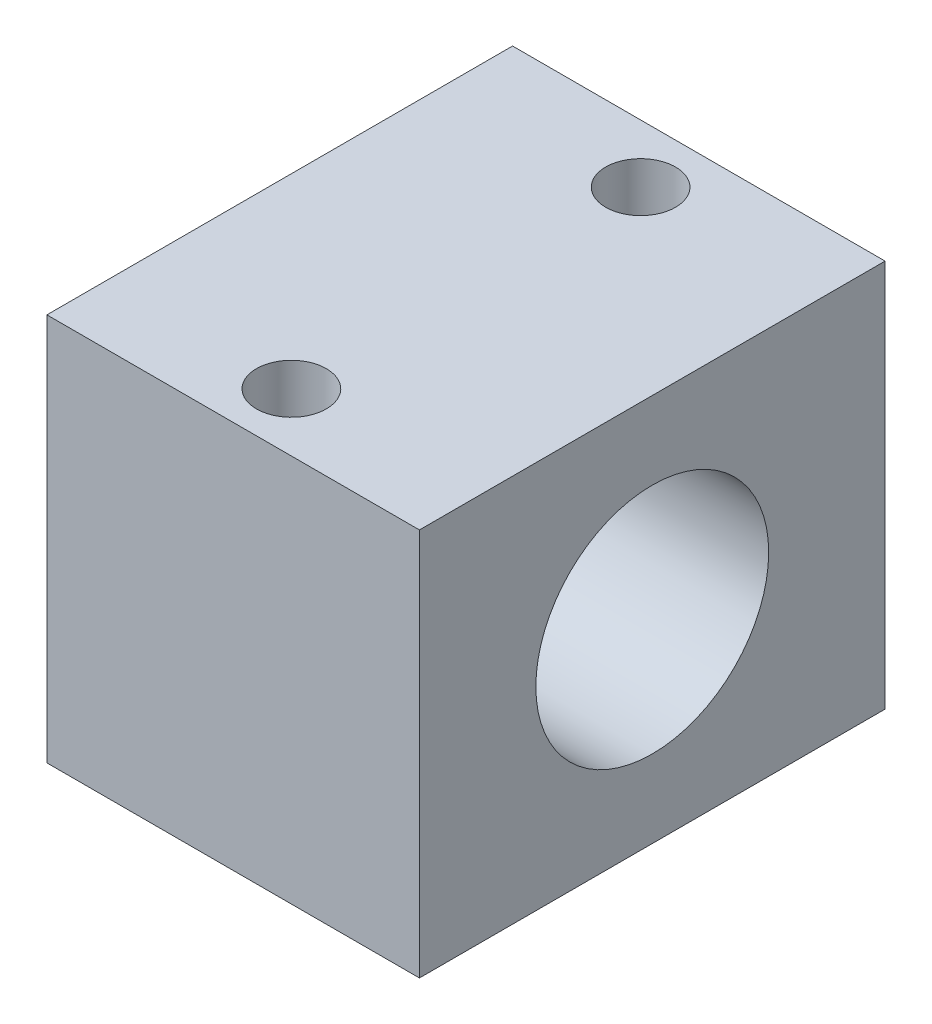
ISO-10303-21;
HEADER;
FILE_DESCRIPTION(('STEP AP214'),'2;1');
FILE_NAME('part.step','',(''),(''),'','','');
FILE_SCHEMA(('AUTOMOTIVE_DESIGN { 1 0 10303 214 1 1 1 1 }'));
ENDSEC;
DATA;
#1=APPLICATION_CONTEXT('core data for automotive mechanical design processes');
#2=APPLICATION_PROTOCOL_DEFINITION('international standard','automotive_design',2000,#1);
#3=PRODUCT_CONTEXT('',#1,'mechanical');
#4=PRODUCT('Part','Part','',(#3));
#5=PRODUCT_RELATED_PRODUCT_CATEGORY('part','',(#4));
#6=PRODUCT_DEFINITION_FORMATION('','',#4);
#7=PRODUCT_DEFINITION_CONTEXT('part definition',#1,'design');
#8=PRODUCT_DEFINITION('design','',#6,#7);
#9=PRODUCT_DEFINITION_SHAPE('','',#8);
#10=(LENGTH_UNIT() NAMED_UNIT(*) SI_UNIT(.MILLI.,.METRE.));
#11=(NAMED_UNIT(*) PLANE_ANGLE_UNIT() SI_UNIT($,.RADIAN.));
#12=(NAMED_UNIT(*) SI_UNIT($,.STERADIAN.) SOLID_ANGLE_UNIT());
#13=UNCERTAINTY_MEASURE_WITH_UNIT(LENGTH_MEASURE(1.E-05),#10,'distance_accuracy_value','');
#14=(GEOMETRIC_REPRESENTATION_CONTEXT(3) GLOBAL_UNCERTAINTY_ASSIGNED_CONTEXT((#13)) GLOBAL_UNIT_ASSIGNED_CONTEXT((#10,
#11,#12)) REPRESENTATION_CONTEXT('',''));
#15=CARTESIAN_POINT('',(0.,0.,0.));
#16=DIRECTION('',(0.,0.,1.));
#17=DIRECTION('',(1.,0.,0.));
#18=AXIS2_PLACEMENT_3D('',#15,#16,#17);
#19=CARTESIAN_POINT('',(24.,-8.47728587319243,-19.2410233592881));
#20=DIRECTION('',(0.,0.,1.));
#21=DIRECTION('',(1.,0.,0.));
#22=AXIS2_PLACEMENT_3D('',#19,#20,#21);
#23=PLANE('',#22);
#24=DIRECTION('',(0.,1.,0.));
#25=VECTOR('',#24,1.);
#26=CARTESIAN_POINT('',(0.,-8.47728587319243,-19.2410233592881));
#27=LINE('',#26,#25);
#28=CARTESIAN_POINT('',(0.,-8.47728587319243,-19.2410233592881));
#29=VERTEX_POINT('',#28);
#30=CARTESIAN_POINT('',(0.,16.5227141268076,-19.2410233592881));
#31=VERTEX_POINT('',#30);
#32=EDGE_CURVE('E95',#29,#31,#27,.T.);
#33=ORIENTED_EDGE('',*,*,#32,.T.);
#34=DIRECTION('',(-1.,0.,0.));
#35=VECTOR('',#34,1.);
#36=CARTESIAN_POINT('',(24.,16.5227141268076,-19.2410233592881));
#37=LINE('',#36,#35);
#38=CARTESIAN_POINT('',(24.,16.5227141268076,-19.2410233592881));
#39=VERTEX_POINT('',#38);
#40=EDGE_CURVE('E11',#39,#31,#37,.T.);
#41=ORIENTED_EDGE('',*,*,#40,.F.);
#42=DIRECTION('',(0.,1.,0.));
#43=VECTOR('',#42,1.);
#44=CARTESIAN_POINT('',(24.,-8.47728587319243,-19.2410233592881));
#45=LINE('',#44,#43);
#46=CARTESIAN_POINT('',(24.,-8.47728587319243,-19.2410233592881));
#47=VERTEX_POINT('',#46);
#48=EDGE_CURVE('E83',#47,#39,#45,.T.);
#49=ORIENTED_EDGE('',*,*,#48,.F.);
#50=DIRECTION('',(-1.,0.,0.));
#51=VECTOR('',#50,1.);
#52=CARTESIAN_POINT('',(24.,-8.47728587319243,-19.2410233592881));
#53=LINE('',#52,#51);
#54=EDGE_CURVE('E91',#47,#29,#53,.T.);
#55=ORIENTED_EDGE('',*,*,#54,.T.);
#56=EDGE_LOOP('',(#33,#41,#49,#55));
#57=FACE_BOUND('',#56,.T.);
#58=ADVANCED_FACE('F32',(#57),#23,.F.);
#59=CARTESIAN_POINT('',(24.,16.5227141268076,-19.2410233592881));
#60=DIRECTION('',(0.,-1.,0.));
#61=DIRECTION('',(0.,0.,-1.));
#62=AXIS2_PLACEMENT_3D('',#59,#60,#61);
#63=PLANE('',#62);
#64=CARTESIAN_POINT('',(12.,16.5227141268076,7.0089766407119));
#65=DIRECTION('',(0.,1.,0.));
#66=DIRECTION('',(0.,0.,1.));
#67=AXIS2_PLACEMENT_3D('',#64,#65,#66);
#68=CIRCLE('',#67,2.25);
#69=CARTESIAN_POINT('',(12.,16.5227141268076,9.2589766407119));
#70=VERTEX_POINT('',#69);
#71=EDGE_CURVE('E123',#70,#70,#68,.T.);
#72=ORIENTED_EDGE('',*,*,#71,.F.);
#73=EDGE_LOOP('',(#72));
#74=FACE_BOUND('',#73,.T.);
#75=CARTESIAN_POINT('',(12.,16.5227141268076,-15.4910233592881));
#76=DIRECTION('',(0.,1.,0.));
#77=DIRECTION('',(0.,0.,1.));
#78=AXIS2_PLACEMENT_3D('',#75,#76,#77);
#79=CIRCLE('',#78,2.25);
#80=CARTESIAN_POINT('',(12.,16.5227141268076,-13.2410233592881));
#81=VERTEX_POINT('',#80);
#82=EDGE_CURVE('E117',#81,#81,#79,.T.);
#83=ORIENTED_EDGE('',*,*,#82,.F.);
#84=EDGE_LOOP('',(#83));
#85=FACE_BOUND('',#84,.T.);
#86=DIRECTION('',(0.,0.,1.));
#87=VECTOR('',#86,1.);
#88=CARTESIAN_POINT('',(0.,16.5227141268076,-19.2410233592881));
#89=LINE('',#88,#87);
#90=CARTESIAN_POINT('',(0.,16.5227141268076,10.7589766407119));
#91=VERTEX_POINT('',#90);
#92=EDGE_CURVE('E87',#31,#91,#89,.T.);
#93=ORIENTED_EDGE('',*,*,#92,.T.);
#94=DIRECTION('',(-1.,0.,0.));
#95=VECTOR('',#94,1.);
#96=CARTESIAN_POINT('',(24.,16.5227141268076,10.7589766407119));
#97=LINE('',#96,#95);
#98=CARTESIAN_POINT('',(24.,16.5227141268076,10.7589766407119));
#99=VERTEX_POINT('',#98);
#100=EDGE_CURVE('E40',#99,#91,#97,.T.);
#101=ORIENTED_EDGE('',*,*,#100,.F.);
#102=DIRECTION('',(0.,0.,1.));
#103=VECTOR('',#102,1.);
#104=CARTESIAN_POINT('',(24.,16.5227141268076,-19.2410233592881));
#105=LINE('',#104,#103);
#106=EDGE_CURVE('E78',#39,#99,#105,.T.);
#107=ORIENTED_EDGE('',*,*,#106,.F.);
#108=ORIENTED_EDGE('',*,*,#40,.T.);
#109=EDGE_LOOP('',(#93,#101,#107,#108));
#110=FACE_BOUND('',#109,.T.);
#111=ADVANCED_FACE('F86',(#74,#85,#110),#63,.F.);
#112=CARTESIAN_POINT('',(24.,16.5227141268076,10.7589766407119));
#113=DIRECTION('',(0.,0.,-1.));
#114=DIRECTION('',(0.,1.,0.));
#115=AXIS2_PLACEMENT_3D('',#112,#113,#114);
#116=PLANE('',#115);
#117=DIRECTION('',(0.,-1.,0.));
#118=VECTOR('',#117,1.);
#119=CARTESIAN_POINT('',(0.,16.5227141268076,10.7589766407119));
#120=LINE('',#119,#118);
#121=CARTESIAN_POINT('',(0.,-8.47728587319243,10.7589766407119));
#122=VERTEX_POINT('',#121);
#123=EDGE_CURVE('E65',#91,#122,#120,.T.);
#124=ORIENTED_EDGE('',*,*,#123,.T.);
#125=DIRECTION('',(-1.,0.,0.));
#126=VECTOR('',#125,1.);
#127=CARTESIAN_POINT('',(24.,-8.47728587319243,10.7589766407119));
#128=LINE('',#127,#126);
#129=CARTESIAN_POINT('',(24.,-8.47728587319243,10.7589766407119));
#130=VERTEX_POINT('',#129);
#131=EDGE_CURVE('E88',#130,#122,#128,.T.);
#132=ORIENTED_EDGE('',*,*,#131,.F.);
#133=DIRECTION('',(0.,-1.,0.));
#134=VECTOR('',#133,1.);
#135=CARTESIAN_POINT('',(24.,16.5227141268076,10.7589766407119));
#136=LINE('',#135,#134);
#137=EDGE_CURVE('E81',#99,#130,#136,.T.);
#138=ORIENTED_EDGE('',*,*,#137,.F.);
#139=ORIENTED_EDGE('',*,*,#100,.T.);
#140=EDGE_LOOP('',(#124,#132,#138,#139));
#141=FACE_BOUND('',#140,.T.);
#142=ADVANCED_FACE('F89',(#141),#116,.F.);
#143=CARTESIAN_POINT('',(24.,-8.47728587319243,10.7589766407119));
#144=DIRECTION('',(0.,1.,0.));
#145=DIRECTION('',(0.,0.,1.));
#146=AXIS2_PLACEMENT_3D('',#143,#144,#145);
#147=PLANE('',#146);
#148=CARTESIAN_POINT('',(12.,-8.47728587319243,7.0089766407119));
#149=DIRECTION('',(0.,1.,0.));
#150=DIRECTION('',(0.,0.,1.));
#151=AXIS2_PLACEMENT_3D('',#148,#149,#150);
#152=CIRCLE('',#151,2.25);
#153=CARTESIAN_POINT('',(12.,-8.47728587319243,9.2589766407119));
#154=VERTEX_POINT('',#153);
#155=EDGE_CURVE('E120',#154,#154,#152,.F.);
#156=ORIENTED_EDGE('',*,*,#155,.F.);
#157=EDGE_LOOP('',(#156));
#158=FACE_BOUND('',#157,.T.);
#159=CARTESIAN_POINT('',(12.,-8.47728587319243,-15.4910233592881));
#160=DIRECTION('',(0.,1.,0.));
#161=DIRECTION('',(0.,0.,1.));
#162=AXIS2_PLACEMENT_3D('',#159,#160,#161);
#163=CIRCLE('',#162,2.25);
#164=CARTESIAN_POINT('',(12.,-8.47728587319243,-13.2410233592881));
#165=VERTEX_POINT('',#164);
#166=EDGE_CURVE('E112',#165,#165,#163,.F.);
#167=ORIENTED_EDGE('',*,*,#166,.F.);
#168=EDGE_LOOP('',(#167));
#169=FACE_BOUND('',#168,.T.);
#170=DIRECTION('',(0.,0.,-1.));
#171=VECTOR('',#170,1.);
#172=CARTESIAN_POINT('',(0.,-8.47728587319243,10.7589766407119));
#173=LINE('',#172,#171);
#174=EDGE_CURVE('E71',#122,#29,#173,.T.);
#175=ORIENTED_EDGE('',*,*,#174,.T.);
#176=ORIENTED_EDGE('',*,*,#54,.F.);
#177=DIRECTION('',(0.,0.,-1.));
#178=VECTOR('',#177,1.);
#179=CARTESIAN_POINT('',(24.,-8.47728587319243,10.7589766407119));
#180=LINE('',#179,#178);
#181=EDGE_CURVE('E48',#130,#47,#180,.T.);
#182=ORIENTED_EDGE('',*,*,#181,.F.);
#183=ORIENTED_EDGE('',*,*,#131,.T.);
#184=EDGE_LOOP('',(#175,#176,#182,#183));
#185=FACE_BOUND('',#184,.T.);
#186=ADVANCED_FACE('F103',(#158,#169,#185),#147,.F.);
#187=CARTESIAN_POINT('',(24.,0.,0.));
#188=DIRECTION('',(1.,0.,0.));
#189=DIRECTION('',(0.,0.,-1.));
#190=AXIS2_PLACEMENT_3D('',#187,#188,#189);
#191=PLANE('',#190);
#192=CARTESIAN_POINT('',(24.,4.02271412680757,-4.2410233592881));
#193=DIRECTION('',(-1.,0.,0.));
#194=DIRECTION('',(0.,0.,1.));
#195=AXIS2_PLACEMENT_3D('',#192,#193,#194);
#196=CIRCLE('',#195,7.5);
#197=CARTESIAN_POINT('',(24.,4.02271412680757,3.2589766407119));
#198=VERTEX_POINT('',#197);
#199=EDGE_CURVE('E98',#198,#198,#196,.T.);
#200=ORIENTED_EDGE('',*,*,#199,.T.);
#201=EDGE_LOOP('',(#200));
#202=FACE_BOUND('',#201,.T.);
#203=ORIENTED_EDGE('',*,*,#48,.T.);
#204=ORIENTED_EDGE('',*,*,#106,.T.);
#205=ORIENTED_EDGE('',*,*,#137,.T.);
#206=ORIENTED_EDGE('',*,*,#181,.T.);
#207=EDGE_LOOP('',(#203,#204,#205,#206));
#208=FACE_BOUND('',#207,.T.);
#209=ADVANCED_FACE('F79',(#202,#208),#191,.T.);
#210=CARTESIAN_POINT('',(0.,0.,0.));
#211=DIRECTION('',(1.,0.,0.));
#212=DIRECTION('',(0.,0.,-1.));
#213=AXIS2_PLACEMENT_3D('',#210,#211,#212);
#214=PLANE('',#213);
#215=CARTESIAN_POINT('',(0.,4.02271412680757,-4.2410233592881));
#216=DIRECTION('',(-1.,0.,0.));
#217=DIRECTION('',(0.,0.,1.));
#218=AXIS2_PLACEMENT_3D('',#215,#216,#217);
#219=CIRCLE('',#218,7.5);
#220=CARTESIAN_POINT('',(0.,4.02271412680757,3.2589766407119));
#221=VERTEX_POINT('',#220);
#222=EDGE_CURVE('E109',#221,#221,#219,.T.);
#223=ORIENTED_EDGE('',*,*,#222,.F.);
#224=EDGE_LOOP('',(#223));
#225=FACE_BOUND('',#224,.T.);
#226=ORIENTED_EDGE('',*,*,#32,.F.);
#227=ORIENTED_EDGE('',*,*,#174,.F.);
#228=ORIENTED_EDGE('',*,*,#123,.F.);
#229=ORIENTED_EDGE('',*,*,#92,.F.);
#230=EDGE_LOOP('',(#226,#227,#228,#229));
#231=FACE_BOUND('',#230,.T.);
#232=ADVANCED_FACE('F106',(#225,#231),#214,.F.);
#233=CARTESIAN_POINT('',(24.,4.02271412680757,-4.2410233592881));
#234=DIRECTION('',(-1.,0.,0.));
#235=DIRECTION('',(0.,0.,1.));
#236=AXIS2_PLACEMENT_3D('',#233,#234,#235);
#237=CYLINDRICAL_SURFACE('',#236,7.5);
#238=ORIENTED_EDGE('',*,*,#199,.F.);
#239=EDGE_LOOP('',(#238));
#240=FACE_BOUND('',#239,.T.);
#241=ORIENTED_EDGE('',*,*,#222,.T.);
#242=EDGE_LOOP('',(#241));
#243=FACE_BOUND('',#242,.T.);
#244=ADVANCED_FACE('F137',(#240,#243),#237,.F.);
#245=CARTESIAN_POINT('',(12.,-8.47828587319243,-15.4910233592881));
#246=DIRECTION('',(0.,1.,0.));
#247=DIRECTION('',(0.,0.,1.));
#248=AXIS2_PLACEMENT_3D('',#245,#246,#247);
#249=CYLINDRICAL_SURFACE('',#248,2.25);
#250=ORIENTED_EDGE('',*,*,#82,.T.);
#251=EDGE_LOOP('',(#250));
#252=FACE_BOUND('',#251,.T.);
#253=ORIENTED_EDGE('',*,*,#166,.T.);
#254=EDGE_LOOP('',(#253));
#255=FACE_BOUND('',#254,.T.);
#256=ADVANCED_FACE('F134',(#252,#255),#249,.F.);
#257=CARTESIAN_POINT('',(12.,-8.47828587319243,7.0089766407119));
#258=DIRECTION('',(0.,1.,0.));
#259=DIRECTION('',(0.,0.,1.));
#260=AXIS2_PLACEMENT_3D('',#257,#258,#259);
#261=CYLINDRICAL_SURFACE('',#260,2.25);
#262=ORIENTED_EDGE('',*,*,#71,.T.);
#263=EDGE_LOOP('',(#262));
#264=FACE_BOUND('',#263,.T.);
#265=ORIENTED_EDGE('',*,*,#155,.T.);
#266=EDGE_LOOP('',(#265));
#267=FACE_BOUND('',#266,.T.);
#268=ADVANCED_FACE('F127',(#264,#267),#261,.F.);
#269=CLOSED_SHELL('',(#58,#111,#142,#186,#209,#232,#244,#256,#268));
#270=MANIFOLD_SOLID_BREP('B2',#269);
#271=ADVANCED_BREP_SHAPE_REPRESENTATION('',(#18,#270),#14);
#272=SHAPE_DEFINITION_REPRESENTATION(#9,#271);
ENDSEC;
END-ISO-10303-21;
